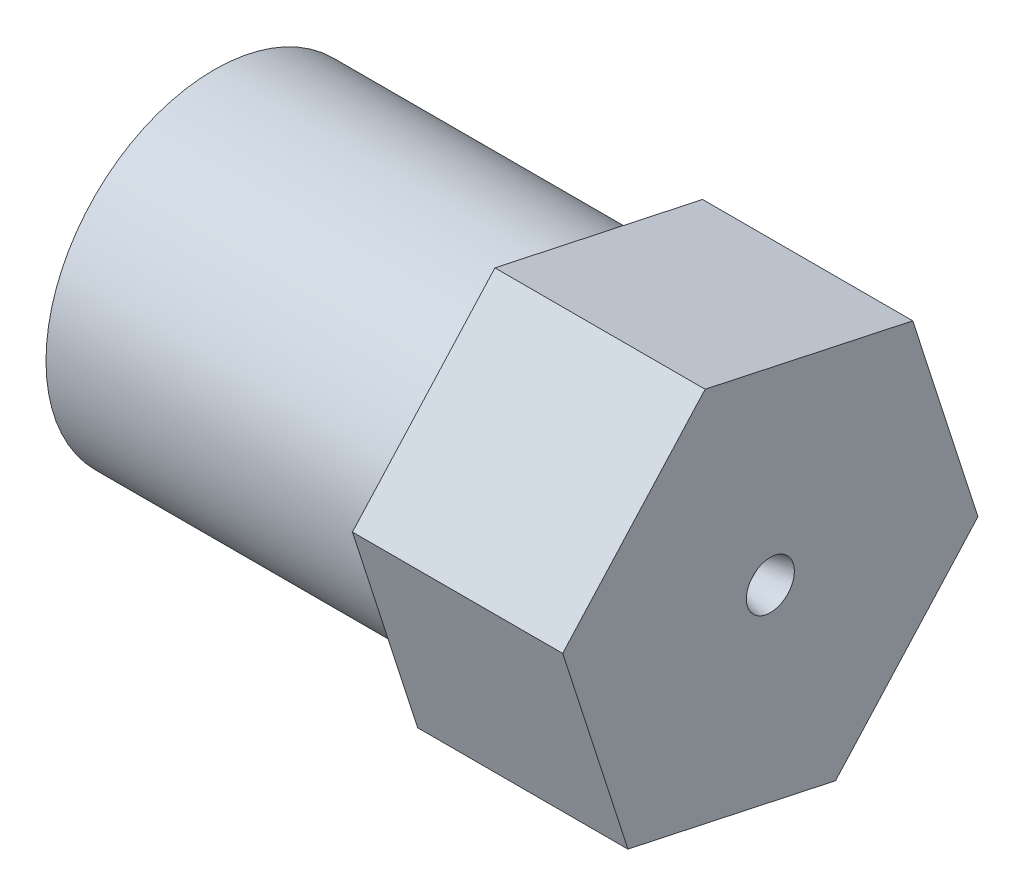
ISO-10303-21;
HEADER;
FILE_DESCRIPTION(('STEP AP214'),'2;1');
FILE_NAME('part.step','',(''),(''),'','','');
FILE_SCHEMA(('AUTOMOTIVE_DESIGN { 1 0 10303 214 1 1 1 1 }'));
ENDSEC;
DATA;
#1=APPLICATION_CONTEXT('core data for automotive mechanical design processes');
#2=APPLICATION_PROTOCOL_DEFINITION('international standard','automotive_design',2000,#1);
#3=PRODUCT_CONTEXT('',#1,'mechanical');
#4=PRODUCT('Part','Part','',(#3));
#5=PRODUCT_RELATED_PRODUCT_CATEGORY('part','',(#4));
#6=PRODUCT_DEFINITION_FORMATION('','',#4);
#7=PRODUCT_DEFINITION_CONTEXT('part definition',#1,'design');
#8=PRODUCT_DEFINITION('design','',#6,#7);
#9=PRODUCT_DEFINITION_SHAPE('','',#8);
#10=(LENGTH_UNIT() NAMED_UNIT(*) SI_UNIT(.MILLI.,.METRE.));
#11=(NAMED_UNIT(*) PLANE_ANGLE_UNIT() SI_UNIT($,.RADIAN.));
#12=(NAMED_UNIT(*) SI_UNIT($,.STERADIAN.) SOLID_ANGLE_UNIT());
#13=UNCERTAINTY_MEASURE_WITH_UNIT(LENGTH_MEASURE(1.E-05),#10,'distance_accuracy_value','');
#14=(GEOMETRIC_REPRESENTATION_CONTEXT(3) GLOBAL_UNCERTAINTY_ASSIGNED_CONTEXT((#13)) GLOBAL_UNIT_ASSIGNED_CONTEXT((#10,
#11,#12)) REPRESENTATION_CONTEXT('',''));
#15=CARTESIAN_POINT('',(0.,0.,0.));
#16=DIRECTION('',(0.,0.,1.));
#17=DIRECTION('',(1.,0.,0.));
#18=AXIS2_PLACEMENT_3D('',#15,#16,#17);
#19=CARTESIAN_POINT('',(0.,0.,0.));
#20=DIRECTION('',(-1.,0.,0.));
#21=DIRECTION('',(0.,0.,1.));
#22=AXIS2_PLACEMENT_3D('',#19,#20,#21);
#23=CYLINDRICAL_SURFACE('',#22,10.16);
#24=CARTESIAN_POINT('',(-11.4850798638843,0.,0.));
#25=DIRECTION('',(1.,0.,0.));
#26=DIRECTION('',(0.,0.,-1.));
#27=AXIS2_PLACEMENT_3D('',#24,#25,#26);
#28=CIRCLE('',#27,10.16);
#29=CARTESIAN_POINT('',(-11.4850798638843,0.,-10.16));
#30=VERTEX_POINT('',#29);
#31=EDGE_CURVE('E11',#30,#30,#28,.F.);
#32=ORIENTED_EDGE('',*,*,#31,.T.);
#33=EDGE_LOOP('',(#32));
#34=FACE_BOUND('',#33,.T.);
#35=CARTESIAN_POINT('',(-31.75,0.,0.));
#36=DIRECTION('',(-1.,0.,0.));
#37=DIRECTION('',(0.,0.,1.));
#38=AXIS2_PLACEMENT_3D('',#35,#36,#37);
#39=CIRCLE('',#38,10.16);
#40=CARTESIAN_POINT('',(-31.75,0.,10.16));
#41=VERTEX_POINT('',#40);
#42=EDGE_CURVE('E242',#41,#41,#39,.T.);
#43=ORIENTED_EDGE('',*,*,#42,.F.);
#44=EDGE_LOOP('',(#43));
#45=FACE_BOUND('',#44,.T.);
#46=ADVANCED_FACE('F43',(#34,#45),#23,.T.);
#47=CARTESIAN_POINT('',(0.,0.,0.));
#48=DIRECTION('',(-1.,0.,0.));
#49=DIRECTION('',(0.,0.,1.));
#50=AXIS2_PLACEMENT_3D('',#47,#48,#49);
#51=TOROIDAL_SURFACE('',#50,2.5,1.5);
#52=CARTESIAN_POINT('',(0.,0.,0.));
#53=DIRECTION('',(-1.,0.,0.));
#54=DIRECTION('',(0.,0.,1.));
#55=AXIS2_PLACEMENT_3D('',#52,#53,#54);
#56=CIRCLE('',#55,1.00000000000469);
#57=CARTESIAN_POINT('',(0.,0.,1.00000000000469));
#58=VERTEX_POINT('',#57);
#59=EDGE_CURVE('E186',#58,#58,#56,.T.);
#60=ORIENTED_EDGE('',*,*,#59,.F.);
#61=EDGE_LOOP('',(#60));
#62=FACE_BOUND('',#61,.T.);
#63=CARTESIAN_POINT('',(-1.06066017177981,0.,0.));
#64=DIRECTION('',(-1.,0.,0.));
#65=DIRECTION('',(0.,0.,1.));
#66=AXIS2_PLACEMENT_3D('',#63,#64,#65);
#67=CIRCLE('',#66,1.43933982822017);
#68=CARTESIAN_POINT('',(-1.06066017177981,0.,1.43933982822017));
#69=VERTEX_POINT('',#68);
#70=EDGE_CURVE('E151',#69,#69,#67,.T.);
#71=ORIENTED_EDGE('',*,*,#70,.T.);
#72=EDGE_LOOP('',(#71));
#73=FACE_BOUND('',#72,.T.);
#74=ADVANCED_FACE('F175',(#62,#73),#51,.T.);
#75=CARTESIAN_POINT('',(0.,0.,0.));
#76=DIRECTION('',(-1.,0.,0.));
#77=DIRECTION('',(0.,0.,1.));
#78=AXIS2_PLACEMENT_3D('',#75,#76,#77);
#79=TOROIDAL_SURFACE('',#78,1.4,0.399999999995305);
#80=CARTESIAN_POINT('',(0.136808057277449,0.,0.));
#81=DIRECTION('',(-1.,0.,0.));
#82=DIRECTION('',(0.,0.,1.));
#83=AXIS2_PLACEMENT_3D('',#80,#81,#82);
#84=CIRCLE('',#83,1.02412295171916);
#85=CARTESIAN_POINT('',(0.136808057277449,0.,1.02412295171916));
#86=VERTEX_POINT('',#85);
#87=EDGE_CURVE('E248',#86,#86,#84,.T.);
#88=ORIENTED_EDGE('',*,*,#87,.F.);
#89=EDGE_LOOP('',(#88));
#90=FACE_BOUND('',#89,.T.);
#91=ORIENTED_EDGE('',*,*,#59,.T.);
#92=EDGE_LOOP('',(#91));
#93=FACE_BOUND('',#92,.T.);
#94=ADVANCED_FACE('F171',(#90,#93),#79,.T.);
#95=CARTESIAN_POINT('',(338201.521527077,-941081.511127626,0.));
#96=CARTESIAN_POINT('',(-342020.006517871,939693.644908766,0.));
#97=CARTESIAN_POINT('',(345839.038740893,-938301.682198099,0.));
#98=B_SPLINE_CURVE_WITH_KNOTS('',2,(#95,#96,#97),.UNSPECIFIED.,.F.,.F.,(3,3),(0.,1.),.UNSPECIFIED.);
#99=CARTESIAN_POINT('',(0.,0.,0.));
#100=DIRECTION('',(-1.,0.,0.));
#101=AXIS1_PLACEMENT('',#99,#100);
#102=SURFACE_OF_REVOLUTION('',#98,#101);
#103=CARTESIAN_POINT('',(1.84992013611573,0.,0.));
#104=DIRECTION('',(-1.,0.,0.));
#105=DIRECTION('',(0.,0.,1.));
#106=AXIS2_PLACEMENT_3D('',#103,#104,#105);
#107=CIRCLE('',#106,1.44913767461894);
#108=CARTESIAN_POINT('',(1.84992013611573,0.,1.44913767461894));
#109=VERTEX_POINT('',#108);
#110=EDGE_CURVE('E245',#109,#109,#107,.T.);
#111=ORIENTED_EDGE('',*,*,#110,.F.);
#112=EDGE_LOOP('',(#111));
#113=FACE_BOUND('',#112,.T.);
#114=ORIENTED_EDGE('',*,*,#87,.T.);
#115=EDGE_LOOP('',(#114));
#116=FACE_BOUND('',#115,.T.);
#117=ADVANCED_FACE('F166',(#113,#116),#102,.T.);
#118=CARTESIAN_POINT('',(1.84992013611573,10.16,0.));
#119=DIRECTION('',(-1.,0.,0.));
#120=DIRECTION('',(0.,0.,1.));
#121=AXIS2_PLACEMENT_3D('',#118,#119,#120);
#122=PLANE('',#121);
#123=ORIENTED_EDGE('',*,*,#110,.T.);
#124=EDGE_LOOP('',(#123));
#125=FACE_BOUND('',#124,.T.);
#126=DIRECTION('',(0.,-0.951681663898051,-0.307086324345838));
#127=VECTOR('',#126,1.);
#128=CARTESIAN_POINT('',(1.84992013611573,-3.41249677929312,10.5755624900671));
#129=LINE('',#128,#127);
#130=CARTESIAN_POINT('',(1.84992013611573,2.69330707117882,12.5457684242007));
#131=VERTEX_POINT('',#130);
#132=CARTESIAN_POINT('',(1.84992013611573,-9.51830062976507,8.60535655593348));
#133=VERTEX_POINT('',#132);
#134=EDGE_CURVE('E133',#131,#133,#129,.T.);
#135=ORIENTED_EDGE('',*,*,#134,.T.);
#136=DIRECTION('',(0.,-0.209896273910742,-0.977723659424475));
#137=VECTOR('',#136,1.);
#138=CARTESIAN_POINT('',(1.84992013611573,-10.8649541653545,2.33247234383312));
#139=LINE('',#138,#137);
#140=CARTESIAN_POINT('',(1.84992013611573,-12.2116077009439,-3.94041186826723));
#141=VERTEX_POINT('',#140);
#142=EDGE_CURVE('E136',#133,#141,#139,.T.);
#143=ORIENTED_EDGE('',*,*,#142,.T.);
#144=DIRECTION('',(0.,0.741785389987309,-0.670637335078637));
#145=VECTOR('',#144,1.);
#146=CARTESIAN_POINT('',(1.84992013611573,-7.45245738606136,-8.24309014623397));
#147=LINE('',#146,#145);
#148=CARTESIAN_POINT('',(1.84992013611573,-2.69330707117882,-12.5457684242007));
#149=VERTEX_POINT('',#148);
#150=EDGE_CURVE('E139',#141,#149,#147,.T.);
#151=ORIENTED_EDGE('',*,*,#150,.T.);
#152=DIRECTION('',(0.,0.951681663898051,0.307086324345838));
#153=VECTOR('',#152,1.);
#154=CARTESIAN_POINT('',(1.84992013611573,3.41249677929312,-10.5755624900671));
#155=LINE('',#154,#153);
#156=CARTESIAN_POINT('',(1.84992013611573,9.51830062976506,-8.60535655593348));
#157=VERTEX_POINT('',#156);
#158=EDGE_CURVE('E142',#149,#157,#155,.T.);
#159=ORIENTED_EDGE('',*,*,#158,.T.);
#160=DIRECTION('',(0.,0.209896273910742,0.977723659424475));
#161=VECTOR('',#160,1.);
#162=CARTESIAN_POINT('',(1.84992013611573,10.8649541653545,-2.33247234383312));
#163=LINE('',#162,#161);
#164=CARTESIAN_POINT('',(1.84992013611573,12.2116077009439,3.94041186826724));
#165=VERTEX_POINT('',#164);
#166=EDGE_CURVE('E109',#157,#165,#163,.T.);
#167=ORIENTED_EDGE('',*,*,#166,.T.);
#168=DIRECTION('',(0.,-0.741785389987309,0.670637335078637));
#169=VECTOR('',#168,1.);
#170=CARTESIAN_POINT('',(1.84992013611573,7.45245738606136,8.24309014623397));
#171=LINE('',#170,#169);
#172=EDGE_CURVE('E145',#165,#131,#171,.T.);
#173=ORIENTED_EDGE('',*,*,#172,.T.);
#174=EDGE_LOOP('',(#135,#143,#151,#159,#167,#173));
#175=FACE_BOUND('',#174,.T.);
#176=ADVANCED_FACE('F170',(#125,#175),#122,.F.);
#177=CARTESIAN_POINT('',(-31.75,10.16,0.));
#178=DIRECTION('',(1.,0.,0.));
#179=DIRECTION('',(0.,0.,-1.));
#180=AXIS2_PLACEMENT_3D('',#177,#178,#179);
#181=PLANE('',#180);
#182=CARTESIAN_POINT('',(-31.75,0.,0.));
#183=DIRECTION('',(-1.,0.,0.));
#184=DIRECTION('',(0.,0.,1.));
#185=AXIS2_PLACEMENT_3D('',#182,#183,#184);
#186=CIRCLE('',#185,8.6614);
#187=CARTESIAN_POINT('',(-31.75,0.,8.6614));
#188=VERTEX_POINT('',#187);
#189=EDGE_CURVE('E238',#188,#188,#186,.T.);
#190=ORIENTED_EDGE('',*,*,#189,.F.);
#191=EDGE_LOOP('',(#190));
#192=FACE_BOUND('',#191,.T.);
#193=ORIENTED_EDGE('',*,*,#42,.T.);
#194=EDGE_LOOP('',(#193));
#195=FACE_BOUND('',#194,.T.);
#196=ADVANCED_FACE('F267',(#192,#195),#181,.F.);
#197=CARTESIAN_POINT('',(-31.115,0.,0.));
#198=DIRECTION('',(-1.,0.,0.));
#199=DIRECTION('',(0.,0.,1.));
#200=AXIS2_PLACEMENT_3D('',#197,#198,#199);
#201=TOROIDAL_SURFACE('',#200,8.6614,0.635);
#202=CARTESIAN_POINT('',(-31.115,0.,0.));
#203=DIRECTION('',(-1.,0.,0.));
#204=DIRECTION('',(0.,0.,1.));
#205=AXIS2_PLACEMENT_3D('',#202,#203,#204);
#206=CIRCLE('',#205,8.02639999999999);
#207=CARTESIAN_POINT('',(-31.115,0.,8.02639999999999));
#208=VERTEX_POINT('',#207);
#209=EDGE_CURVE('E234',#208,#208,#206,.T.);
#210=ORIENTED_EDGE('',*,*,#209,.F.);
#211=EDGE_LOOP('',(#210));
#212=FACE_BOUND('',#211,.T.);
#213=ORIENTED_EDGE('',*,*,#189,.T.);
#214=EDGE_LOOP('',(#213));
#215=FACE_BOUND('',#214,.T.);
#216=ADVANCED_FACE('F269',(#212,#215),#201,.T.);
#217=CARTESIAN_POINT('',(0.,0.,0.));
#218=DIRECTION('',(-1.,0.,0.));
#219=DIRECTION('',(0.,0.,1.));
#220=AXIS2_PLACEMENT_3D('',#217,#218,#219);
#221=CYLINDRICAL_SURFACE('',#220,8.02639999999999);
#222=CARTESIAN_POINT('',(-25.019,0.,0.));
#223=DIRECTION('',(-1.,0.,0.));
#224=DIRECTION('',(0.,0.,1.));
#225=AXIS2_PLACEMENT_3D('',#222,#223,#224);
#226=CIRCLE('',#225,8.02639999999999);
#227=CARTESIAN_POINT('',(-25.019,0.,8.02639999999999));
#228=VERTEX_POINT('',#227);
#229=EDGE_CURVE('E230',#228,#228,#226,.T.);
#230=ORIENTED_EDGE('',*,*,#229,.F.);
#231=EDGE_LOOP('',(#230));
#232=FACE_BOUND('',#231,.T.);
#233=ORIENTED_EDGE('',*,*,#209,.T.);
#234=EDGE_LOOP('',(#233));
#235=FACE_BOUND('',#234,.T.);
#236=ADVANCED_FACE('F276',(#232,#235),#221,.F.);
#237=CARTESIAN_POINT('',(-25.019,0.,0.));
#238=DIRECTION('',(-1.,0.,0.));
#239=DIRECTION('',(0.,0.,1.));
#240=AXIS2_PLACEMENT_3D('',#237,#238,#239);
#241=TOROIDAL_SURFACE('',#240,7.89939999999999,0.127);
#242=CARTESIAN_POINT('',(-24.892,0.,0.));
#243=DIRECTION('',(-1.,0.,0.));
#244=DIRECTION('',(0.,0.,1.));
#245=AXIS2_PLACEMENT_3D('',#242,#243,#244);
#246=CIRCLE('',#245,7.89939999999999);
#247=CARTESIAN_POINT('',(-24.892,0.,7.89939999999999));
#248=VERTEX_POINT('',#247);
#249=EDGE_CURVE('E226',#248,#248,#246,.T.);
#250=ORIENTED_EDGE('',*,*,#249,.F.);
#251=EDGE_LOOP('',(#250));
#252=FACE_BOUND('',#251,.T.);
#253=ORIENTED_EDGE('',*,*,#229,.T.);
#254=EDGE_LOOP('',(#253));
#255=FACE_BOUND('',#254,.T.);
#256=ADVANCED_FACE('F284',(#252,#255),#241,.F.);
#257=CARTESIAN_POINT('',(-24.892,6.9469,0.));
#258=DIRECTION('',(1.,0.,0.));
#259=DIRECTION('',(0.,0.,-1.));
#260=AXIS2_PLACEMENT_3D('',#257,#258,#259);
#261=PLANE('',#260);
#262=CARTESIAN_POINT('',(-24.892,0.,0.));
#263=DIRECTION('',(-1.,0.,0.));
#264=DIRECTION('',(0.,0.,1.));
#265=AXIS2_PLACEMENT_3D('',#262,#263,#264);
#266=CIRCLE('',#265,6.9469);
#267=CARTESIAN_POINT('',(-24.892,0.,6.9469));
#268=VERTEX_POINT('',#267);
#269=EDGE_CURVE('E222',#268,#268,#266,.T.);
#270=ORIENTED_EDGE('',*,*,#269,.F.);
#271=EDGE_LOOP('',(#270));
#272=FACE_BOUND('',#271,.T.);
#273=ORIENTED_EDGE('',*,*,#249,.T.);
#274=EDGE_LOOP('',(#273));
#275=FACE_BOUND('',#274,.T.);
#276=ADVANCED_FACE('F288',(#272,#275),#261,.F.);
#277=CARTESIAN_POINT('',(0.,0.,0.));
#278=DIRECTION('',(-1.,0.,0.));
#279=DIRECTION('',(0.,0.,1.));
#280=AXIS2_PLACEMENT_3D('',#277,#278,#279);
#281=CYLINDRICAL_SURFACE('',#280,6.9469);
#282=CARTESIAN_POINT('',(-20.066,0.,0.));
#283=DIRECTION('',(-1.,0.,0.));
#284=DIRECTION('',(0.,0.,1.));
#285=AXIS2_PLACEMENT_3D('',#282,#283,#284);
#286=CIRCLE('',#285,6.9469);
#287=CARTESIAN_POINT('',(-20.066,0.,6.9469));
#288=VERTEX_POINT('',#287);
#289=EDGE_CURVE('E218',#288,#288,#286,.T.);
#290=ORIENTED_EDGE('',*,*,#289,.F.);
#291=EDGE_LOOP('',(#290));
#292=FACE_BOUND('',#291,.T.);
#293=ORIENTED_EDGE('',*,*,#269,.T.);
#294=EDGE_LOOP('',(#293));
#295=FACE_BOUND('',#294,.T.);
#296=ADVANCED_FACE('F292',(#292,#295),#281,.F.);
#297=CARTESIAN_POINT('',(-20.066,0.,0.));
#298=DIRECTION('',(-1.,0.,0.));
#299=DIRECTION('',(0.,0.,1.));
#300=AXIS2_PLACEMENT_3D('',#297,#298,#299);
#301=TOROIDAL_SURFACE('',#300,6.8199,0.127);
#302=CARTESIAN_POINT('',(-19.939,0.,0.));
#303=DIRECTION('',(-1.,0.,0.));
#304=DIRECTION('',(0.,0.,1.));
#305=AXIS2_PLACEMENT_3D('',#302,#303,#304);
#306=CIRCLE('',#305,6.8199);
#307=CARTESIAN_POINT('',(-19.939,0.,6.8199));
#308=VERTEX_POINT('',#307);
#309=EDGE_CURVE('E214',#308,#308,#306,.T.);
#310=ORIENTED_EDGE('',*,*,#309,.F.);
#311=EDGE_LOOP('',(#310));
#312=FACE_BOUND('',#311,.T.);
#313=ORIENTED_EDGE('',*,*,#289,.T.);
#314=EDGE_LOOP('',(#313));
#315=FACE_BOUND('',#314,.T.);
#316=ADVANCED_FACE('F296',(#312,#315),#301,.F.);
#317=CARTESIAN_POINT('',(-19.939,5.46100000000001,0.));
#318=DIRECTION('',(1.,0.,0.));
#319=DIRECTION('',(0.,0.,-1.));
#320=AXIS2_PLACEMENT_3D('',#317,#318,#319);
#321=PLANE('',#320);
#322=CARTESIAN_POINT('',(-19.939,0.,0.));
#323=DIRECTION('',(-1.,0.,0.));
#324=DIRECTION('',(0.,0.,1.));
#325=AXIS2_PLACEMENT_3D('',#322,#323,#324);
#326=CIRCLE('',#325,5.46100000000001);
#327=CARTESIAN_POINT('',(-19.939,0.,5.46100000000001));
#328=VERTEX_POINT('',#327);
#329=EDGE_CURVE('E210',#328,#328,#326,.T.);
#330=ORIENTED_EDGE('',*,*,#329,.F.);
#331=EDGE_LOOP('',(#330));
#332=FACE_BOUND('',#331,.T.);
#333=ORIENTED_EDGE('',*,*,#309,.T.);
#334=EDGE_LOOP('',(#333));
#335=FACE_BOUND('',#334,.T.);
#336=ADVANCED_FACE('F300',(#332,#335),#321,.F.);
#337=CARTESIAN_POINT('',(-19.304,0.,0.));
#338=DIRECTION('',(-1.,0.,0.));
#339=DIRECTION('',(0.,0.,1.));
#340=AXIS2_PLACEMENT_3D('',#337,#338,#339);
#341=TOROIDAL_SURFACE('',#340,5.461,0.635);
#342=CARTESIAN_POINT('',(-19.304,0.,0.));
#343=DIRECTION('',(-1.,0.,0.));
#344=DIRECTION('',(0.,0.,1.));
#345=AXIS2_PLACEMENT_3D('',#342,#343,#344);
#346=CIRCLE('',#345,4.826);
#347=CARTESIAN_POINT('',(-19.304,0.,4.826));
#348=VERTEX_POINT('',#347);
#349=EDGE_CURVE('E207',#348,#348,#346,.T.);
#350=ORIENTED_EDGE('',*,*,#349,.F.);
#351=EDGE_LOOP('',(#350));
#352=FACE_BOUND('',#351,.T.);
#353=ORIENTED_EDGE('',*,*,#329,.T.);
#354=EDGE_LOOP('',(#353));
#355=FACE_BOUND('',#354,.T.);
#356=ADVANCED_FACE('F304',(#352,#355),#341,.T.);
#357=CARTESIAN_POINT('',(0.,0.,0.));
#358=DIRECTION('',(-1.,0.,0.));
#359=DIRECTION('',(0.,0.,1.));
#360=AXIS2_PLACEMENT_3D('',#357,#358,#359);
#361=CYLINDRICAL_SURFACE('',#360,4.826);
#362=CARTESIAN_POINT('',(-13.589,0.,0.));
#363=DIRECTION('',(-1.,0.,0.));
#364=DIRECTION('',(0.,0.,1.));
#365=AXIS2_PLACEMENT_3D('',#362,#363,#364);
#366=CIRCLE('',#365,4.826);
#367=CARTESIAN_POINT('',(-13.589,0.,4.826));
#368=VERTEX_POINT('',#367);
#369=EDGE_CURVE('E204',#368,#368,#366,.T.);
#370=ORIENTED_EDGE('',*,*,#369,.F.);
#371=EDGE_LOOP('',(#370));
#372=FACE_BOUND('',#371,.T.);
#373=ORIENTED_EDGE('',*,*,#349,.T.);
#374=EDGE_LOOP('',(#373));
#375=FACE_BOUND('',#374,.T.);
#376=ADVANCED_FACE('F308',(#372,#375),#361,.F.);
#377=CARTESIAN_POINT('',(-13.589,0.,0.));
#378=DIRECTION('',(-1.,0.,0.));
#379=DIRECTION('',(0.,0.,1.));
#380=AXIS2_PLACEMENT_3D('',#377,#378,#379);
#381=TOROIDAL_SURFACE('',#380,4.699,0.127);
#382=CARTESIAN_POINT('',(-13.462,0.,0.));
#383=DIRECTION('',(-1.,0.,0.));
#384=DIRECTION('',(0.,0.,1.));
#385=AXIS2_PLACEMENT_3D('',#382,#383,#384);
#386=CIRCLE('',#385,4.699);
#387=CARTESIAN_POINT('',(-13.462,0.,4.699));
#388=VERTEX_POINT('',#387);
#389=EDGE_CURVE('E201',#388,#388,#386,.T.);
#390=ORIENTED_EDGE('',*,*,#389,.F.);
#391=EDGE_LOOP('',(#390));
#392=FACE_BOUND('',#391,.T.);
#393=ORIENTED_EDGE('',*,*,#369,.T.);
#394=EDGE_LOOP('',(#393));
#395=FACE_BOUND('',#394,.T.);
#396=ADVANCED_FACE('F312',(#392,#395),#381,.F.);
#397=CARTESIAN_POINT('',(-13.462,4.445,0.));
#398=DIRECTION('',(1.,0.,0.));
#399=DIRECTION('',(0.,0.,-1.));
#400=AXIS2_PLACEMENT_3D('',#397,#398,#399);
#401=PLANE('',#400);
#402=CARTESIAN_POINT('',(-13.462,0.,0.));
#403=DIRECTION('',(-1.,0.,0.));
#404=DIRECTION('',(0.,0.,1.));
#405=AXIS2_PLACEMENT_3D('',#402,#403,#404);
#406=CIRCLE('',#405,4.445);
#407=CARTESIAN_POINT('',(-13.462,0.,4.445));
#408=VERTEX_POINT('',#407);
#409=EDGE_CURVE('E196',#408,#408,#406,.T.);
#410=ORIENTED_EDGE('',*,*,#409,.F.);
#411=EDGE_LOOP('',(#410));
#412=FACE_BOUND('',#411,.T.);
#413=ORIENTED_EDGE('',*,*,#389,.T.);
#414=EDGE_LOOP('',(#413));
#415=FACE_BOUND('',#414,.T.);
#416=ADVANCED_FACE('F316',(#412,#415),#401,.F.);
#417=CARTESIAN_POINT('',(0.,0.,0.));
#418=DIRECTION('',(-1.,0.,0.));
#419=DIRECTION('',(0.,0.,1.));
#420=AXIS2_PLACEMENT_3D('',#417,#418,#419);
#421=CYLINDRICAL_SURFACE('',#420,4.445);
#422=CARTESIAN_POINT('',(-5.38144840409426,0.,0.));
#423=DIRECTION('',(-1.,0.,0.));
#424=DIRECTION('',(0.,0.,1.));
#425=AXIS2_PLACEMENT_3D('',#422,#423,#424);
#426=CIRCLE('',#425,4.445);
#427=CARTESIAN_POINT('',(-5.38144840409426,0.,4.445));
#428=VERTEX_POINT('',#427);
#429=EDGE_CURVE('E192',#428,#428,#426,.T.);
#430=ORIENTED_EDGE('',*,*,#429,.F.);
#431=EDGE_LOOP('',(#430));
#432=FACE_BOUND('',#431,.T.);
#433=ORIENTED_EDGE('',*,*,#409,.T.);
#434=EDGE_LOOP('',(#433));
#435=FACE_BOUND('',#434,.T.);
#436=ADVANCED_FACE('F320',(#432,#435),#421,.F.);
#437=CARTESIAN_POINT('',(-5.38144840409426,0.,0.));
#438=DIRECTION('',(-1.,0.,0.));
#439=DIRECTION('',(0.,0.,1.));
#440=AXIS2_PLACEMENT_3D('',#437,#438,#439);
#441=DEGENERATE_TOROIDAL_SURFACE('',#440,1.27,3.175,.T.);
#442=CARTESIAN_POINT('',(-3.136384373827,0.,0.));
#443=DIRECTION('',(-1.,0.,0.));
#444=DIRECTION('',(0.,0.,1.));
#445=AXIS2_PLACEMENT_3D('',#442,#443,#444);
#446=CIRCLE('',#445,3.51506403026731);
#447=CARTESIAN_POINT('',(-3.136384373827,0.,3.51506403026731));
#448=VERTEX_POINT('',#447);
#449=EDGE_CURVE('E190',#448,#448,#446,.T.);
#450=ORIENTED_EDGE('',*,*,#449,.F.);
#451=EDGE_LOOP('',(#450));
#452=FACE_BOUND('',#451,.T.);
#453=ORIENTED_EDGE('',*,*,#429,.T.);
#454=EDGE_LOOP('',(#453));
#455=FACE_BOUND('',#454,.T.);
#456=ADVANCED_FACE('F324',(#452,#455),#441,.F.);
#457=CARTESIAN_POINT('',(-3.136384373827,0.,0.));
#458=DIRECTION('',(-1.,0.,0.));
#459=DIRECTION('',(0.,0.,1.));
#460=AXIS2_PLACEMENT_3D('',#457,#458,#459);
#461=CONICAL_SURFACE('',#460,3.51506403026731,0.785398163397437);
#462=ORIENTED_EDGE('',*,*,#70,.F.);
#463=EDGE_LOOP('',(#462));
#464=FACE_BOUND('',#463,.T.);
#465=ORIENTED_EDGE('',*,*,#449,.T.);
#466=EDGE_LOOP('',(#465));
#467=FACE_BOUND('',#466,.T.);
#468=ADVANCED_FACE('F328',(#464,#467),#461,.F.);
#469=CARTESIAN_POINT('',(-10.8500798638843,-3.41249677929312,10.5755624900671));
#470=DIRECTION('',(0.,-0.307086324345838,0.951681663898051));
#471=DIRECTION('',(0.,-0.951681663898051,-0.307086324345838));
#472=AXIS2_PLACEMENT_3D('',#469,#470,#471);
#473=PLANE('',#472);
#474=ORIENTED_EDGE('',*,*,#134,.F.);
#475=DIRECTION('',(1.,0.,0.));
#476=VECTOR('',#475,1.);
#477=CARTESIAN_POINT('',(-10.8500798638843,2.69330707117882,12.5457684242007));
#478=LINE('',#477,#476);
#479=CARTESIAN_POINT('',(-10.8500798638843,2.69330707117882,12.5457684242007));
#480=VERTEX_POINT('',#479);
#481=EDGE_CURVE('E61',#480,#131,#478,.T.);
#482=ORIENTED_EDGE('',*,*,#481,.F.);
#483=DIRECTION('',(0.,-0.951681663898051,-0.307086324345838));
#484=VECTOR('',#483,1.);
#485=CARTESIAN_POINT('',(-10.8500798638843,-3.41249677929312,10.5755624900671));
#486=LINE('',#485,#484);
#487=CARTESIAN_POINT('',(-10.8500798638843,-9.51830062976507,8.60535655593348));
#488=VERTEX_POINT('',#487);
#489=EDGE_CURVE('E148',#480,#488,#486,.T.);
#490=ORIENTED_EDGE('',*,*,#489,.T.);
#491=DIRECTION('',(1.,0.,0.));
#492=VECTOR('',#491,1.);
#493=CARTESIAN_POINT('',(-10.8500798638843,-9.51830062976507,8.60535655593348));
#494=LINE('',#493,#492);
#495=EDGE_CURVE('E96',#488,#133,#494,.T.);
#496=ORIENTED_EDGE('',*,*,#495,.T.);
#497=EDGE_LOOP('',(#474,#482,#490,#496));
#498=FACE_BOUND('',#497,.T.);
#499=ADVANCED_FACE('F332',(#498),#473,.T.);
#500=CARTESIAN_POINT('',(-10.8500798638843,7.45245738606136,8.24309014623397));
#501=DIRECTION('',(0.,0.670637335078637,0.741785389987309));
#502=DIRECTION('',(0.,-0.741785389987309,0.670637335078637));
#503=AXIS2_PLACEMENT_3D('',#500,#501,#502);
#504=PLANE('',#503);
#505=ORIENTED_EDGE('',*,*,#172,.F.);
#506=DIRECTION('',(1.,0.,0.));
#507=VECTOR('',#506,1.);
#508=CARTESIAN_POINT('',(-10.8500798638843,12.2116077009439,3.94041186826724));
#509=LINE('',#508,#507);
#510=CARTESIAN_POINT('',(-10.8500798638843,12.2116077009439,3.94041186826724));
#511=VERTEX_POINT('',#510);
#512=EDGE_CURVE('E84',#511,#165,#509,.T.);
#513=ORIENTED_EDGE('',*,*,#512,.F.);
#514=DIRECTION('',(0.,-0.741785389987309,0.670637335078637));
#515=VECTOR('',#514,1.);
#516=CARTESIAN_POINT('',(-10.8500798638843,7.45245738606136,8.24309014623397));
#517=LINE('',#516,#515);
#518=EDGE_CURVE('E122',#511,#480,#517,.T.);
#519=ORIENTED_EDGE('',*,*,#518,.T.);
#520=ORIENTED_EDGE('',*,*,#481,.T.);
#521=EDGE_LOOP('',(#505,#513,#519,#520));
#522=FACE_BOUND('',#521,.T.);
#523=ADVANCED_FACE('F335',(#522),#504,.T.);
#524=CARTESIAN_POINT('',(-10.8500798638843,10.8649541653545,-2.33247234383312));
#525=DIRECTION('',(0.,0.977723659424475,-0.209896273910742));
#526=DIRECTION('',(0.,0.209896273910742,0.977723659424475));
#527=AXIS2_PLACEMENT_3D('',#524,#525,#526);
#528=PLANE('',#527);
#529=ORIENTED_EDGE('',*,*,#166,.F.);
#530=DIRECTION('',(1.,0.,0.));
#531=VECTOR('',#530,1.);
#532=CARTESIAN_POINT('',(-10.8500798638843,9.51830062976506,-8.60535655593348));
#533=LINE('',#532,#531);
#534=CARTESIAN_POINT('',(-10.8500798638843,9.51830062976506,-8.60535655593348));
#535=VERTEX_POINT('',#534);
#536=EDGE_CURVE('E104',#535,#157,#533,.T.);
#537=ORIENTED_EDGE('',*,*,#536,.F.);
#538=DIRECTION('',(0.,0.209896273910742,0.977723659424475));
#539=VECTOR('',#538,1.);
#540=CARTESIAN_POINT('',(-10.8500798638843,10.8649541653545,-2.33247234383312));
#541=LINE('',#540,#539);
#542=EDGE_CURVE('E107',#535,#511,#541,.T.);
#543=ORIENTED_EDGE('',*,*,#542,.T.);
#544=ORIENTED_EDGE('',*,*,#512,.T.);
#545=EDGE_LOOP('',(#529,#537,#543,#544));
#546=FACE_BOUND('',#545,.T.);
#547=ADVANCED_FACE('F106',(#546),#528,.T.);
#548=CARTESIAN_POINT('',(-10.8500798638843,3.41249677929312,-10.5755624900671));
#549=DIRECTION('',(0.,0.307086324345838,-0.951681663898051));
#550=DIRECTION('',(0.,0.951681663898051,0.307086324345838));
#551=AXIS2_PLACEMENT_3D('',#548,#549,#550);
#552=PLANE('',#551);
#553=ORIENTED_EDGE('',*,*,#158,.F.);
#554=DIRECTION('',(1.,0.,0.));
#555=VECTOR('',#554,1.);
#556=CARTESIAN_POINT('',(-10.8500798638843,-2.69330707117882,-12.5457684242007));
#557=LINE('',#556,#555);
#558=CARTESIAN_POINT('',(-10.8500798638843,-2.69330707117882,-12.5457684242007));
#559=VERTEX_POINT('',#558);
#560=EDGE_CURVE('E114',#559,#149,#557,.T.);
#561=ORIENTED_EDGE('',*,*,#560,.F.);
#562=DIRECTION('',(0.,0.951681663898051,0.307086324345838));
#563=VECTOR('',#562,1.);
#564=CARTESIAN_POINT('',(-10.8500798638843,3.41249677929312,-10.5755624900671));
#565=LINE('',#564,#563);
#566=EDGE_CURVE('E120',#559,#535,#565,.T.);
#567=ORIENTED_EDGE('',*,*,#566,.T.);
#568=ORIENTED_EDGE('',*,*,#536,.T.);
#569=EDGE_LOOP('',(#553,#561,#567,#568));
#570=FACE_BOUND('',#569,.T.);
#571=ADVANCED_FACE('F124',(#570),#552,.T.);
#572=CARTESIAN_POINT('',(-10.8500798638843,-7.45245738606136,-8.24309014623397));
#573=DIRECTION('',(0.,-0.670637335078637,-0.741785389987309));
#574=DIRECTION('',(0.,0.741785389987309,-0.670637335078637));
#575=AXIS2_PLACEMENT_3D('',#572,#573,#574);
#576=PLANE('',#575);
#577=ORIENTED_EDGE('',*,*,#150,.F.);
#578=DIRECTION('',(1.,0.,0.));
#579=VECTOR('',#578,1.);
#580=CARTESIAN_POINT('',(-10.8500798638843,-12.2116077009439,-3.94041186826723));
#581=LINE('',#580,#579);
#582=CARTESIAN_POINT('',(-10.8500798638843,-12.2116077009439,-3.94041186826723));
#583=VERTEX_POINT('',#582);
#584=EDGE_CURVE('E154',#583,#141,#581,.T.);
#585=ORIENTED_EDGE('',*,*,#584,.F.);
#586=DIRECTION('',(0.,0.741785389987309,-0.670637335078637));
#587=VECTOR('',#586,1.);
#588=CARTESIAN_POINT('',(-10.8500798638843,-7.45245738606136,-8.24309014623397));
#589=LINE('',#588,#587);
#590=EDGE_CURVE('E125',#583,#559,#589,.T.);
#591=ORIENTED_EDGE('',*,*,#590,.T.);
#592=ORIENTED_EDGE('',*,*,#560,.T.);
#593=EDGE_LOOP('',(#577,#585,#591,#592));
#594=FACE_BOUND('',#593,.T.);
#595=ADVANCED_FACE('F338',(#594),#576,.T.);
#596=CARTESIAN_POINT('',(-10.8500798638843,-10.8649541653545,2.33247234383312));
#597=DIRECTION('',(0.,-0.977723659424475,0.209896273910742));
#598=DIRECTION('',(0.,-0.209896273910742,-0.977723659424475));
#599=AXIS2_PLACEMENT_3D('',#596,#597,#598);
#600=PLANE('',#599);
#601=ORIENTED_EDGE('',*,*,#142,.F.);
#602=ORIENTED_EDGE('',*,*,#495,.F.);
#603=DIRECTION('',(0.,-0.209896273910742,-0.977723659424475));
#604=VECTOR('',#603,1.);
#605=CARTESIAN_POINT('',(-10.8500798638843,-10.8649541653545,2.33247234383312));
#606=LINE('',#605,#604);
#607=EDGE_CURVE('E127',#488,#583,#606,.T.);
#608=ORIENTED_EDGE('',*,*,#607,.T.);
#609=ORIENTED_EDGE('',*,*,#584,.T.);
#610=EDGE_LOOP('',(#601,#602,#608,#609));
#611=FACE_BOUND('',#610,.T.);
#612=ADVANCED_FACE('F261',(#611),#600,.T.);
#613=CARTESIAN_POINT('',(-10.8500798638843,0.,0.));
#614=DIRECTION('',(1.,0.,0.));
#615=DIRECTION('',(0.,0.,-1.));
#616=AXIS2_PLACEMENT_3D('',#613,#614,#615);
#617=PLANE('',#616);
#618=CARTESIAN_POINT('',(-10.8500798638843,0.,0.));
#619=DIRECTION('',(1.,0.,0.));
#620=DIRECTION('',(0.,0.,-1.));
#621=AXIS2_PLACEMENT_3D('',#618,#619,#620);
#622=CIRCLE('',#621,10.795);
#623=CARTESIAN_POINT('',(-10.8500798638843,0.,-10.795));
#624=VERTEX_POINT('',#623);
#625=EDGE_CURVE('E53',#624,#624,#622,.T.);
#626=ORIENTED_EDGE('',*,*,#625,.T.);
#627=EDGE_LOOP('',(#626));
#628=FACE_BOUND('',#627,.T.);
#629=ORIENTED_EDGE('',*,*,#489,.F.);
#630=ORIENTED_EDGE('',*,*,#518,.F.);
#631=ORIENTED_EDGE('',*,*,#542,.F.);
#632=ORIENTED_EDGE('',*,*,#566,.F.);
#633=ORIENTED_EDGE('',*,*,#590,.F.);
#634=ORIENTED_EDGE('',*,*,#607,.F.);
#635=EDGE_LOOP('',(#629,#630,#631,#632,#633,#634));
#636=FACE_BOUND('',#635,.T.);
#637=ADVANCED_FACE('F118',(#628,#636),#617,.F.);
#638=CARTESIAN_POINT('',(-11.4850798638843,0.,0.));
#639=DIRECTION('',(1.,0.,0.));
#640=DIRECTION('',(0.,0.,-1.));
#641=AXIS2_PLACEMENT_3D('',#638,#639,#640);
#642=TOROIDAL_SURFACE('',#641,10.795,0.635);
#643=ORIENTED_EDGE('',*,*,#31,.F.);
#644=EDGE_LOOP('',(#643));
#645=FACE_BOUND('',#644,.T.);
#646=ORIENTED_EDGE('',*,*,#625,.F.);
#647=EDGE_LOOP('',(#646));
#648=FACE_BOUND('',#647,.T.);
#649=ADVANCED_FACE('F45',(#645,#648),#642,.F.);
#650=CLOSED_SHELL('',(#46,#74,#94,#117,#176,#196,#216,#236,#256,#276,#296,#316,#336,#356,#376,
#396,#416,#436,#456,#468,#499,#523,#547,#571,#595,#612,#637,#649));
#651=MANIFOLD_SOLID_BREP('B2',#650);
#652=ADVANCED_BREP_SHAPE_REPRESENTATION('',(#18,#651),#14);
#653=SHAPE_DEFINITION_REPRESENTATION(#9,#652);
ENDSEC;
END-ISO-10303-21;
